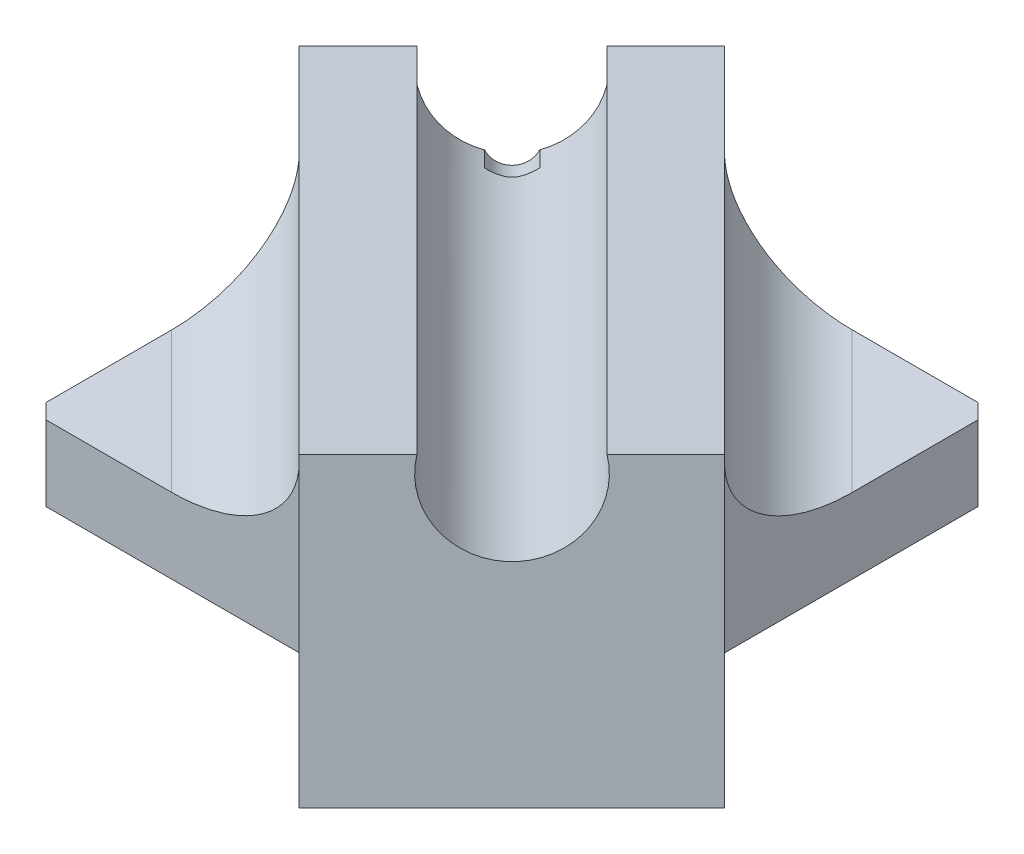
ISO-10303-21;
HEADER;
FILE_DESCRIPTION(('STEP AP214'),'2;1');
FILE_NAME('part.step','',(''),(''),'','','');
FILE_SCHEMA(('AUTOMOTIVE_DESIGN { 1 0 10303 214 1 1 1 1 }'));
ENDSEC;
DATA;
#1=APPLICATION_CONTEXT('core data for automotive mechanical design processes');
#2=APPLICATION_PROTOCOL_DEFINITION('international standard','automotive_design',2000,#1);
#3=PRODUCT_CONTEXT('',#1,'mechanical');
#4=PRODUCT('Part','Part','',(#3));
#5=PRODUCT_RELATED_PRODUCT_CATEGORY('part','',(#4));
#6=PRODUCT_DEFINITION_FORMATION('','',#4);
#7=PRODUCT_DEFINITION_CONTEXT('part definition',#1,'design');
#8=PRODUCT_DEFINITION('design','',#6,#7);
#9=PRODUCT_DEFINITION_SHAPE('','',#8);
#10=(LENGTH_UNIT() NAMED_UNIT(*) SI_UNIT(.MILLI.,.METRE.));
#11=(NAMED_UNIT(*) PLANE_ANGLE_UNIT() SI_UNIT($,.RADIAN.));
#12=(NAMED_UNIT(*) SI_UNIT($,.STERADIAN.) SOLID_ANGLE_UNIT());
#13=UNCERTAINTY_MEASURE_WITH_UNIT(LENGTH_MEASURE(1.E-05),#10,'distance_accuracy_value','');
#14=(GEOMETRIC_REPRESENTATION_CONTEXT(3) GLOBAL_UNCERTAINTY_ASSIGNED_CONTEXT((#13)) GLOBAL_UNIT_ASSIGNED_CONTEXT((#10,
#11,#12)) REPRESENTATION_CONTEXT('',''));
#15=CARTESIAN_POINT('',(0.,0.,0.));
#16=DIRECTION('',(0.,0.,1.));
#17=DIRECTION('',(1.,0.,0.));
#18=AXIS2_PLACEMENT_3D('',#15,#16,#17);
#19=CARTESIAN_POINT('',(0.,5.,0.));
#20=DIRECTION('',(0.,1.,0.));
#21=DIRECTION('',(0.,0.,1.));
#22=AXIS2_PLACEMENT_3D('',#19,#20,#21);
#23=PLANE('',#22);
#24=CARTESIAN_POINT('',(-17.6037161868033,5.,-17.6114393949631));
#25=DIRECTION('',(0.,1.,0.));
#26=DIRECTION('',(-0.707106781186548,0.,-0.707106781186547));
#27=AXIS2_PLACEMENT_3D('',#24,#25,#26);
#28=ELLIPSE('',#27,8.34339519950923,1.44881537194977);
#29=CARTESIAN_POINT('',(-16.,5.,-14.156631808591));
#30=VERTEX_POINT('',#29);
#31=CARTESIAN_POINT('',(-15.9097976733528,5.,-14.0804206747715));
#32=VERTEX_POINT('',#31);
#33=EDGE_CURVE('E265',#30,#32,#28,.T.);
#34=ORIENTED_EDGE('',*,*,#33,.F.);
#35=DIRECTION('',(0.,0.,1.));
#36=VECTOR('',#35,1.);
#37=CARTESIAN_POINT('',(-16.,5.,16.));
#38=LINE('',#37,#36);
#39=CARTESIAN_POINT('',(-16.,5.,-14.1045146425066));
#40=VERTEX_POINT('',#39);
#41=EDGE_CURVE('E331',#30,#40,#38,.T.);
#42=ORIENTED_EDGE('',*,*,#41,.T.);
#43=CARTESIAN_POINT('',(-32.8858444157036,5.,-32.8858444157036));
#44=DIRECTION('',(0.,1.,0.));
#45=DIRECTION('',(0.707106781186548,0.,0.707106781186548));
#46=AXIS2_PLACEMENT_3D('',#43,#44,#45);
#47=ELLIPSE('',#46,26.3751688127983,4.58);
#48=EDGE_CURVE('E350',#32,#40,#47,.F.);
#49=ORIENTED_EDGE('',*,*,#48,.F.);
#50=EDGE_LOOP('',(#34,#42,#49));
#51=FACE_BOUND('',#50,.T.);
#52=ADVANCED_FACE('F35',(#51),#23,.T.);
#53=DIRECTION('',(-0.701968169373424,0.,-0.71220831867265));
#54=VECTOR('',#53,1.);
#55=CARTESIAN_POINT('',(0.820894913174256,5.,-0.809092065258149));
#56=LINE('',#55,#54);
#57=CARTESIAN_POINT('',(-14.0867905583232,5.,-15.934247404471));
#58=VERTEX_POINT('',#57);
#59=CARTESIAN_POINT('',(-14.1515977613633,5.,-16.));
#60=VERTEX_POINT('',#59);
#61=EDGE_CURVE('E260',#58,#60,#56,.T.);
#62=ORIENTED_EDGE('',*,*,#61,.F.);
#63=CARTESIAN_POINT('',(-14.1045146425066,5.,-16.));
#64=VERTEX_POINT('',#63);
#65=EDGE_CURVE('E351',#64,#58,#47,.F.);
#66=ORIENTED_EDGE('',*,*,#65,.F.);
#67=DIRECTION('',(-1.,0.,0.));
#68=VECTOR('',#67,1.);
#69=CARTESIAN_POINT('',(16.,5.,-16.));
#70=LINE('',#69,#68);
#71=EDGE_CURVE('E340',#64,#60,#70,.T.);
#72=ORIENTED_EDGE('',*,*,#71,.T.);
#73=EDGE_LOOP('',(#62,#66,#72));
#74=FACE_BOUND('',#73,.T.);
#75=ADVANCED_FACE('F396',(#74),#23,.T.);
#76=CARTESIAN_POINT('',(16.,5.,-16.));
#77=DIRECTION('',(0.,0.,1.));
#78=DIRECTION('',(1.,0.,0.));
#79=AXIS2_PLACEMENT_3D('',#76,#77,#78);
#80=PLANE('',#79);
#81=CARTESIAN_POINT('',(-16.,9.21072183403139,-16.));
#82=DIRECTION('',(0.,0.,1.));
#83=DIRECTION('',(0.970287525247815,0.241954785752361,0.));
#84=AXIS2_PLACEMENT_3D('',#81,#82,#83);
#85=ELLIPSE('',#84,6.57701779444509,4.58);
#86=CARTESIAN_POINT('',(-14.1525431538522,4.98360366927338,-16.));
#87=VERTEX_POINT('',#86);
#88=EDGE_CURVE('E324',#64,#87,#85,.F.);
#89=ORIENTED_EDGE('',*,*,#88,.T.);
#90=DIRECTION('',(0.0575631778132726,0.998341865575133,0.));
#91=VECTOR('',#90,1.);
#92=CARTESIAN_POINT('',(-14.0516898560351,6.7327438890642,-16.));
#93=LINE('',#92,#91);
#94=EDGE_CURVE('E257',#87,#60,#93,.T.);
#95=ORIENTED_EDGE('',*,*,#94,.T.);
#96=ORIENTED_EDGE('',*,*,#71,.F.);
#97=EDGE_LOOP('',(#89,#95,#96));
#98=FACE_BOUND('',#97,.T.);
#99=ADVANCED_FACE('F392',(#98),#80,.F.);
#100=CARTESIAN_POINT('',(-16.,5.,16.));
#101=DIRECTION('',(1.,0.,0.));
#102=DIRECTION('',(0.,0.,-1.));
#103=AXIS2_PLACEMENT_3D('',#100,#101,#102);
#104=PLANE('',#103);
#105=DIRECTION('',(0.,0.970287525247815,-0.241954785752361));
#106=VECTOR('',#105,1.);
#107=CARTESIAN_POINT('',(-16.,-2.07974308648351,-12.3911987002612));
#108=LINE('',#107,#106);
#109=CARTESIAN_POINT('',(-16.,4.98360366927338,-14.1525431538522));
#110=VERTEX_POINT('',#109);
#111=EDGE_CURVE('E354',#110,#30,#108,.T.);
#112=ORIENTED_EDGE('',*,*,#111,.F.);
#113=CARTESIAN_POINT('',(-16.,9.21072183403139,-16.));
#114=DIRECTION('',(1.,0.,0.));
#115=DIRECTION('',(0.,0.241954785752361,0.970287525247815));
#116=AXIS2_PLACEMENT_3D('',#113,#114,#115);
#117=ELLIPSE('',#116,6.57701779444509,4.58);
#118=EDGE_CURVE('E327',#110,#40,#117,.F.);
#119=ORIENTED_EDGE('',*,*,#118,.T.);
#120=ORIENTED_EDGE('',*,*,#41,.F.);
#121=EDGE_LOOP('',(#112,#119,#120));
#122=FACE_BOUND('',#121,.T.);
#123=ADVANCED_FACE('F395',(#122),#104,.F.);
#124=DIRECTION('',(0.,0.,1.));
#125=VECTOR('',#124,1.);
#126=CARTESIAN_POINT('',(-16.,0.,16.));
#127=LINE('',#126,#125);
#128=CARTESIAN_POINT('',(-16.,0.,-6.25204097902476));
#129=VERTEX_POINT('',#128);
#130=CARTESIAN_POINT('',(-16.,0.,15.));
#131=VERTEX_POINT('',#130);
#132=EDGE_CURVE('E330',#129,#131,#127,.T.);
#133=ORIENTED_EDGE('',*,*,#132,.T.);
#134=DIRECTION('',(0.,1.,0.));
#135=VECTOR('',#134,1.);
#136=CARTESIAN_POINT('',(-16.,5.,15.));
#137=LINE('',#136,#135);
#138=CARTESIAN_POINT('',(-16.,5.,15.));
#139=VERTEX_POINT('',#138);
#140=EDGE_CURVE('E44',#131,#139,#137,.T.);
#141=ORIENTED_EDGE('',*,*,#140,.T.);
#142=CARTESIAN_POINT('',(-16.,5.,6.63887279737288));
#143=VERTEX_POINT('',#142);
#144=EDGE_CURVE('E335',#143,#139,#38,.T.);
#145=ORIENTED_EDGE('',*,*,#144,.F.);
#146=CARTESIAN_POINT('',(-16.,11.,6.63887279737288));
#147=DIRECTION('',(1.,0.,0.));
#148=DIRECTION('',(0.,0.,-1.));
#149=AXIS2_PLACEMENT_3D('',#146,#147,#148);
#150=ELLIPSE('',#149,8.48528137423857,6.);
#151=CARTESIAN_POINT('',(-16.,11.,-1.84640857686569));
#152=VERTEX_POINT('',#151);
#153=EDGE_CURVE('E504',#143,#152,#150,.T.);
#154=ORIENTED_EDGE('',*,*,#153,.T.);
#155=DIRECTION('',(0.,-1.,0.));
#156=VECTOR('',#155,1.);
#157=CARTESIAN_POINT('',(-16.,4.99999999999999,-1.84640857686569));
#158=LINE('',#157,#156);
#159=CARTESIAN_POINT('',(-16.,0.549748037251333,-1.84640857686569));
#160=VERTEX_POINT('',#159);
#161=EDGE_CURVE('E319',#152,#160,#158,.T.);
#162=ORIENTED_EDGE('',*,*,#161,.T.);
#163=DIRECTION('',(0.,-0.12382271652573,-0.992304355967557));
#164=VECTOR('',#163,1.);
#165=CARTESIAN_POINT('',(-16.,2.81076461708729,16.273179363364));
#166=LINE('',#165,#164);
#167=EDGE_CURVE('E316',#160,#129,#166,.T.);
#168=ORIENTED_EDGE('',*,*,#167,.T.);
#169=EDGE_LOOP('',(#133,#141,#145,#154,#162,#168));
#170=FACE_BOUND('',#169,.T.);
#171=ADVANCED_FACE('F403',(#170),#104,.F.);
#172=CARTESIAN_POINT('',(15.,5.,-16.));
#173=VERTEX_POINT('',#172);
#174=CARTESIAN_POINT('',(6.61596119856617,5.,-16.));
#175=VERTEX_POINT('',#174);
#176=EDGE_CURVE('E243',#173,#175,#70,.T.);
#177=ORIENTED_EDGE('',*,*,#176,.F.);
#178=DIRECTION('',(0.,-1.,0.));
#179=VECTOR('',#178,1.);
#180=CARTESIAN_POINT('',(15.,5.,-16.));
#181=LINE('',#180,#179);
#182=CARTESIAN_POINT('',(15.,0.,-16.));
#183=VERTEX_POINT('',#182);
#184=EDGE_CURVE('E490',#173,#183,#181,.T.);
#185=ORIENTED_EDGE('',*,*,#184,.T.);
#186=DIRECTION('',(-1.,0.,0.));
#187=VECTOR('',#186,1.);
#188=CARTESIAN_POINT('',(16.,0.,-16.));
#189=LINE('',#188,#187);
#190=CARTESIAN_POINT('',(-6.23623555925377,0.,-16.));
#191=VERTEX_POINT('',#190);
#192=EDGE_CURVE('E346',#183,#191,#189,.T.);
#193=ORIENTED_EDGE('',*,*,#192,.T.);
#194=DIRECTION('',(0.992328965241095,0.123625340216061,0.));
#195=VECTOR('',#194,1.);
#196=CARTESIAN_POINT('',(16.2735436441686,2.80429092537412,-16.));
#197=LINE('',#196,#195);
#198=CARTESIAN_POINT('',(-1.86932017567241,0.544034709153964,-16.));
#199=VERTEX_POINT('',#198);
#200=EDGE_CURVE('E300',#191,#199,#197,.T.);
#201=ORIENTED_EDGE('',*,*,#200,.T.);
#202=DIRECTION('',(0.,1.,0.));
#203=VECTOR('',#202,1.);
#204=CARTESIAN_POINT('',(-1.86932017567241,5.,-16.));
#205=LINE('',#204,#203);
#206=CARTESIAN_POINT('',(-1.86932017567241,11.,-16.));
#207=VERTEX_POINT('',#206);
#208=EDGE_CURVE('E322',#199,#207,#205,.T.);
#209=ORIENTED_EDGE('',*,*,#208,.T.);
#210=CARTESIAN_POINT('',(6.61596119856616,11.,-16.));
#211=DIRECTION('',(0.,0.,1.));
#212=DIRECTION('',(1.,0.,0.));
#213=AXIS2_PLACEMENT_3D('',#210,#211,#212);
#214=ELLIPSE('',#213,8.48528137423857,6.);
#215=EDGE_CURVE('E526',#207,#175,#214,.T.);
#216=ORIENTED_EDGE('',*,*,#215,.T.);
#217=EDGE_LOOP('',(#177,#185,#193,#201,#209,#216));
#218=FACE_BOUND('',#217,.T.);
#219=ADVANCED_FACE('F398',(#218),#80,.F.);
#220=DIRECTION('',(0.,0.,-1.));
#221=VECTOR('',#220,1.);
#222=CARTESIAN_POINT('',(16.,5.,16.));
#223=LINE('',#222,#221);
#224=CARTESIAN_POINT('',(16.,5.,-6.61596119856616));
#225=VERTEX_POINT('',#224);
#226=CARTESIAN_POINT('',(16.,5.,-15.));
#227=VERTEX_POINT('',#226);
#228=EDGE_CURVE('E337',#225,#227,#223,.T.);
#229=ORIENTED_EDGE('',*,*,#228,.T.);
#230=DIRECTION('',(0.707106781186545,0.,0.70710678118655));
#231=VECTOR('',#230,1.);
#232=CARTESIAN_POINT('',(15.5000000000001,5.,-15.4999999999999));
#233=LINE('',#232,#231);
#234=EDGE_CURVE('E487',#227,#173,#233,.F.);
#235=ORIENTED_EDGE('',*,*,#234,.T.);
#236=ORIENTED_EDGE('',*,*,#176,.T.);
#237=DIRECTION('',(-0.707106781186548,0.,-0.707106781186548));
#238=VECTOR('',#237,1.);
#239=CARTESIAN_POINT('',(20.2426406871193,5.,-2.37332051144687));
#240=LINE('',#239,#238);
#241=EDGE_CURVE('E527',#175,#225,#240,.F.);
#242=ORIENTED_EDGE('',*,*,#241,.T.);
#243=EDGE_LOOP('',(#229,#235,#236,#242));
#244=FACE_BOUND('',#243,.T.);
#245=ADVANCED_FACE('F388',(#244),#23,.T.);
#246=CARTESIAN_POINT('',(16.,5.,16.));
#247=DIRECTION('',(0.,0.,-1.));
#248=DIRECTION('',(-1.,0.,0.));
#249=AXIS2_PLACEMENT_3D('',#246,#247,#248);
#250=PLANE('',#249);
#251=DIRECTION('',(1.,0.,0.));
#252=VECTOR('',#251,1.);
#253=CARTESIAN_POINT('',(16.,5.,16.));
#254=LINE('',#253,#252);
#255=CARTESIAN_POINT('',(-15.,5.,16.));
#256=VERTEX_POINT('',#255);
#257=CARTESIAN_POINT('',(-6.63887279737288,5.,16.));
#258=VERTEX_POINT('',#257);
#259=EDGE_CURVE('E334',#256,#258,#254,.T.);
#260=ORIENTED_EDGE('',*,*,#259,.F.);
#261=DIRECTION('',(0.,-1.,0.));
#262=VECTOR('',#261,1.);
#263=CARTESIAN_POINT('',(-15.,5.,16.));
#264=LINE('',#263,#262);
#265=CARTESIAN_POINT('',(-15.,0.,16.));
#266=VERTEX_POINT('',#265);
#267=EDGE_CURVE('E493',#256,#266,#264,.T.);
#268=ORIENTED_EDGE('',*,*,#267,.T.);
#269=DIRECTION('',(1.,0.,0.));
#270=VECTOR('',#269,1.);
#271=CARTESIAN_POINT('',(16.,0.,16.));
#272=LINE('',#271,#270);
#273=CARTESIAN_POINT('',(16.,0.,16.));
#274=VERTEX_POINT('',#273);
#275=EDGE_CURVE('E238',#266,#274,#272,.T.);
#276=ORIENTED_EDGE('',*,*,#275,.T.);
#277=DIRECTION('',(0.,-1.,0.));
#278=VECTOR('',#277,1.);
#279=CARTESIAN_POINT('',(16.,5.,16.));
#280=LINE('',#279,#278);
#281=CARTESIAN_POINT('',(16.,6.76326865006806,16.));
#282=VERTEX_POINT('',#281);
#283=EDGE_CURVE('E234',#282,#274,#280,.T.);
#284=ORIENTED_EDGE('',*,*,#283,.F.);
#285=DIRECTION('',(-0.992328965241095,-0.123625340216062,0.));
#286=VECTOR('',#285,1.);
#287=CARTESIAN_POINT('',(4.31887442463834,5.3080222812293,15.9999999999999));
#288=LINE('',#287,#286);
#289=CARTESIAN_POINT('',(1.84640857686555,5.,16.0000000000001));
#290=VERTEX_POINT('',#289);
#291=EDGE_CURVE('E223',#282,#290,#288,.T.);
#292=ORIENTED_EDGE('',*,*,#291,.T.);
#293=DIRECTION('',(0.,-1.,0.));
#294=VECTOR('',#293,1.);
#295=CARTESIAN_POINT('',(1.84640857686569,10.2914652592007,16.));
#296=LINE('',#295,#294);
#297=CARTESIAN_POINT('',(1.84640857686569,11.,16.));
#298=VERTEX_POINT('',#297);
#299=EDGE_CURVE('E531',#298,#290,#296,.T.);
#300=ORIENTED_EDGE('',*,*,#299,.F.);
#301=CARTESIAN_POINT('',(-6.63887279737288,11.,16.));
#302=DIRECTION('',(0.,0.,-1.));
#303=DIRECTION('',(-1.,0.,0.));
#304=AXIS2_PLACEMENT_3D('',#301,#302,#303);
#305=ELLIPSE('',#304,8.48528137423857,6.);
#306=EDGE_CURVE('E506',#298,#258,#305,.T.);
#307=ORIENTED_EDGE('',*,*,#306,.T.);
#308=EDGE_LOOP('',(#260,#268,#276,#284,#292,#300,#307));
#309=FACE_BOUND('',#308,.T.);
#310=ADVANCED_FACE('F235',(#309),#250,.F.);
#311=CARTESIAN_POINT('',(16.,5.,16.));
#312=DIRECTION('',(-1.,0.,0.));
#313=DIRECTION('',(0.,0.,1.));
#314=AXIS2_PLACEMENT_3D('',#311,#312,#313);
#315=PLANE('',#314);
#316=DIRECTION('',(0.,0.,-1.));
#317=VECTOR('',#316,1.);
#318=CARTESIAN_POINT('',(16.,0.,16.));
#319=LINE('',#318,#317);
#320=CARTESIAN_POINT('',(16.,0.,-15.));
#321=VERTEX_POINT('',#320);
#322=EDGE_CURVE('E344',#274,#321,#319,.T.);
#323=ORIENTED_EDGE('',*,*,#322,.T.);
#324=DIRECTION('',(0.,1.,0.));
#325=VECTOR('',#324,1.);
#326=CARTESIAN_POINT('',(16.,5.,-15.));
#327=LINE('',#326,#325);
#328=EDGE_CURVE('E488',#321,#227,#327,.T.);
#329=ORIENTED_EDGE('',*,*,#328,.T.);
#330=ORIENTED_EDGE('',*,*,#228,.F.);
#331=CARTESIAN_POINT('',(16.,11.,-6.61596119856616));
#332=DIRECTION('',(-1.,0.,0.));
#333=DIRECTION('',(0.,0.,1.));
#334=AXIS2_PLACEMENT_3D('',#331,#332,#333);
#335=ELLIPSE('',#334,8.48528137423857,6.);
#336=CARTESIAN_POINT('',(16.,10.9009604785299,1.86816411559598));
#337=VERTEX_POINT('',#336);
#338=EDGE_CURVE('E467',#225,#337,#335,.T.);
#339=ORIENTED_EDGE('',*,*,#338,.T.);
#340=DIRECTION('',(0.,0.99999998080954,-0.000195910489226005));
#341=VECTOR('',#340,1.);
#342=CARTESIAN_POINT('',(16.,4.99723165165565,1.8693207180209));
#343=LINE('',#342,#341);
#344=CARTESIAN_POINT('',(16.,5.,1.86932017567241));
#345=VERTEX_POINT('',#344);
#346=EDGE_CURVE('E247',#345,#337,#343,.T.);
#347=ORIENTED_EDGE('',*,*,#346,.F.);
#348=DIRECTION('',(0.,0.12382271652573,0.992304355967557));
#349=VECTOR('',#348,1.);
#350=CARTESIAN_POINT('',(16.,7.04524072394658,18.2596993913692));
#351=LINE('',#350,#349);
#352=EDGE_CURVE('E214',#345,#282,#351,.T.);
#353=ORIENTED_EDGE('',*,*,#352,.T.);
#354=ORIENTED_EDGE('',*,*,#283,.T.);
#355=EDGE_LOOP('',(#323,#329,#330,#339,#347,#353,#354));
#356=FACE_BOUND('',#355,.T.);
#357=ADVANCED_FACE('F245',(#356),#315,.F.);
#358=ORIENTED_EDGE('',*,*,#144,.T.);
#359=DIRECTION('',(-0.707106781186545,0.,-0.70710678118655));
#360=VECTOR('',#359,1.);
#361=CARTESIAN_POINT('',(-15.5000000000001,5.,15.4999999999999));
#362=LINE('',#361,#360);
#363=EDGE_CURVE('E11',#139,#256,#362,.F.);
#364=ORIENTED_EDGE('',*,*,#363,.T.);
#365=ORIENTED_EDGE('',*,*,#259,.T.);
#366=DIRECTION('',(0.707106781186548,0.,0.707106781186548));
#367=VECTOR('',#366,1.);
#368=CARTESIAN_POINT('',(-20.2426406871193,5.,2.39623211025359));
#369=LINE('',#368,#367);
#370=EDGE_CURVE('E535',#258,#143,#369,.F.);
#371=ORIENTED_EDGE('',*,*,#370,.T.);
#372=EDGE_LOOP('',(#358,#364,#365,#371));
#373=FACE_BOUND('',#372,.T.);
#374=ADVANCED_FACE('F385',(#373),#23,.T.);
#375=CARTESIAN_POINT('',(0.,0.,0.));
#376=DIRECTION('',(0.,1.,0.));
#377=DIRECTION('',(0.,0.,1.));
#378=AXIS2_PLACEMENT_3D('',#375,#376,#377);
#379=PLANE('',#378);
#380=ORIENTED_EDGE('',*,*,#192,.F.);
#381=DIRECTION('',(-0.707106781186545,0.,-0.70710678118655));
#382=VECTOR('',#381,1.);
#383=CARTESIAN_POINT('',(15.,0.,-16.));
#384=LINE('',#383,#382);
#385=EDGE_CURVE('E496',#183,#321,#384,.F.);
#386=ORIENTED_EDGE('',*,*,#385,.T.);
#387=ORIENTED_EDGE('',*,*,#322,.F.);
#388=ORIENTED_EDGE('',*,*,#275,.F.);
#389=DIRECTION('',(0.707106781186545,0.,0.70710678118655));
#390=VECTOR('',#389,1.);
#391=CARTESIAN_POINT('',(-15.,0.,16.));
#392=LINE('',#391,#390);
#393=EDGE_CURVE('E500',#266,#131,#392,.F.);
#394=ORIENTED_EDGE('',*,*,#393,.T.);
#395=ORIENTED_EDGE('',*,*,#132,.F.);
#396=DIRECTION('',(0.707679338975407,0.,-0.706533759410922));
#397=VECTOR('',#396,1.);
#398=CARTESIAN_POINT('',(-11.1130556380688,0.,-11.1310744365598));
#399=LINE('',#398,#397);
#400=EDGE_CURVE('E242',#129,#191,#399,.T.);
#401=ORIENTED_EDGE('',*,*,#400,.T.);
#402=EDGE_LOOP('',(#380,#386,#387,#388,#394,#395,#401));
#403=FACE_BOUND('',#402,.T.);
#404=ADVANCED_FACE('F381',(#403),#379,.F.);
#405=CARTESIAN_POINT('',(-15.6152785916971,9.30665750618846,-15.6152785916971));
#406=DIRECTION('',(0.696364240320019,0.173648177666927,0.696364240320019));
#407=DIRECTION('',(0.707106781186548,0.,-0.707106781186548));
#408=AXIS2_PLACEMENT_3D('',#405,#406,#407);
#409=CYLINDRICAL_SURFACE('',#408,4.58);
#410=DIRECTION('',(-0.696364240320019,-0.173648177666927,-0.696364240320019));
#411=VECTOR('',#410,1.);
#412=CARTESIAN_POINT('',(-14.9459490531895,5.2403491545764,-13.1165720546081));
#413=LINE('',#412,#411);
#414=CARTESIAN_POINT('',(-14.5977669330295,5.32717324340986,-12.7683899344481));
#415=VERTEX_POINT('',#414);
#416=EDGE_CURVE('E262',#32,#415,#413,.F.);
#417=ORIENTED_EDGE('',*,*,#416,.F.);
#418=ORIENTED_EDGE('',*,*,#48,.T.);
#419=ORIENTED_EDGE('',*,*,#118,.F.);
#420=CARTESIAN_POINT('',(-15.6152785916971,9.30665750618846,-15.6152785916971));
#421=DIRECTION('',(-0.696364240320019,-0.173648177666927,-0.696364240320019));
#422=DIRECTION('',(0.707106781186548,0.,-0.707106781186548));
#423=AXIS2_PLACEMENT_3D('',#420,#421,#422);
#424=CIRCLE('',#423,4.58);
#425=CARTESIAN_POINT('',(-18.8984777612956,10.2914652592007,-12.5776550300366));
#426=VERTEX_POINT('',#425);
#427=EDGE_CURVE('E281',#110,#426,#424,.T.);
#428=ORIENTED_EDGE('',*,*,#427,.T.);
#429=DIRECTION('',(0.696364240320019,0.173648177666927,0.696364240320019));
#430=VECTOR('',#429,1.);
#431=CARTESIAN_POINT('',(-18.8984777612956,10.2914652592007,-12.5776550300366));
#432=LINE('',#431,#430);
#433=CARTESIAN_POINT('',(12.4379130531053,18.1056332542124,18.7587357843643));
#434=VERTEX_POINT('',#433);
#435=EDGE_CURVE('E297',#426,#434,#432,.T.);
#436=ORIENTED_EDGE('',*,*,#435,.T.);
#437=CARTESIAN_POINT('',(15.7211122227038,17.1208255012002,15.7211122227038));
#438=DIRECTION('',(-0.696364240320019,-0.173648177666927,-0.696364240320019));
#439=DIRECTION('',(0.707106781186548,0.,-0.707106781186548));
#440=AXIS2_PLACEMENT_3D('',#437,#438,#439);
#441=CIRCLE('',#440,4.58);
#442=CARTESIAN_POINT('',(18.7587357843643,18.1056332542124,12.4379130531053));
#443=VERTEX_POINT('',#442);
#444=EDGE_CURVE('E267',#443,#434,#441,.T.);
#445=ORIENTED_EDGE('',*,*,#444,.F.);
#446=DIRECTION('',(0.696364240320019,0.173648177666927,0.696364240320019));
#447=VECTOR('',#446,1.);
#448=CARTESIAN_POINT('',(-12.5776550300366,10.2914652592007,-18.8984777612956));
#449=LINE('',#448,#447);
#450=CARTESIAN_POINT('',(-12.5776550300366,10.2914652592007,-18.8984777612956));
#451=VERTEX_POINT('',#450);
#452=EDGE_CURVE('E298',#451,#443,#449,.T.);
#453=ORIENTED_EDGE('',*,*,#452,.F.);
#454=EDGE_CURVE('E282',#451,#87,#424,.T.);
#455=ORIENTED_EDGE('',*,*,#454,.T.);
#456=ORIENTED_EDGE('',*,*,#88,.F.);
#457=ORIENTED_EDGE('',*,*,#65,.T.);
#458=DIRECTION('',(-0.696364240320019,-0.173648177666927,-0.696364240320019));
#459=VECTOR('',#458,1.);
#460=CARTESIAN_POINT('',(-12.0634504328922,5.50454820227416,-13.9109072790399));
#461=LINE('',#460,#459);
#462=CARTESIAN_POINT('',(-12.7598146732122,5.33090002460723,-14.60727151936));
#463=VERTEX_POINT('',#462);
#464=EDGE_CURVE('E255',#463,#58,#461,.T.);
#465=ORIENTED_EDGE('',*,*,#464,.F.);
#466=CARTESIAN_POINT('',(-12.7598146732122,5.33090002460723,-14.60727151936));
#467=CARTESIAN_POINT('',(-12.763682133456,5.32637235621939,-14.5710942577702));
#468=CARTESIAN_POINT('',(-12.7678051269917,5.32206022412393,-14.5349181659168));
#469=CARTESIAN_POINT('',(-12.7766336127534,5.31386089338401,-14.4625838343661));
#470=CARTESIAN_POINT('',(-12.7813391872698,5.30997375491683,-14.4264255979168));
#471=CARTESIAN_POINT('',(-12.7964766862895,5.29891215061462,-14.3177185648517));
#472=CARTESIAN_POINT('',(-12.8078987069297,5.2923747287532,-14.245235900869));
#473=CARTESIAN_POINT('',(-12.8346320124548,5.28075673725322,-14.0986273072941));
#474=CARTESIAN_POINT('',(-12.8500486567127,5.27572515875044,-14.0245164455431));
#475=CARTESIAN_POINT('',(-12.8861006234222,5.26727031059369,-13.8775504745293));
#476=CARTESIAN_POINT('',(-12.906725925257,5.26384398841917,-13.8046932377513));
#477=CARTESIAN_POINT('',(-12.9407586850837,5.26004744560987,-13.7051265000082));
#478=CARTESIAN_POINT('',(-12.9509140657561,5.25908670536377,-13.6773301385892));
#479=CARTESIAN_POINT('',(-12.9725985861352,5.25736082797769,-13.6222721303662));
#480=CARTESIAN_POINT('',(-12.9841278298811,5.2565957056652,-13.5950105242402));
#481=CARTESIAN_POINT('',(-13.0209637479107,5.25457393960808,-13.5145385126261));
#482=CARTESIAN_POINT('',(-13.0486150099751,5.25358004950212,-13.4623432035439));
#483=CARTESIAN_POINT('',(-13.1113011506907,5.25215031230718,-13.3632841942797));
#484=CARTESIAN_POINT('',(-13.1462495969954,5.25170832192039,-13.3163671885242));
#485=CARTESIAN_POINT('',(-13.2238481739381,5.25126033304268,-13.2295277854238));
#486=CARTESIAN_POINT('',(-13.2664825971006,5.25125345523809,-13.1895914439289));
#487=CARTESIAN_POINT('',(-13.3675410679459,5.25174960700457,-13.1100262196565));
#488=CARTESIAN_POINT('',(-13.4273994560363,5.25236033219114,-13.0722334948062));
#489=CARTESIAN_POINT('',(-13.5212872118564,5.25396924526452,-13.0228855727787));
#490=CARTESIAN_POINT('',(-13.5534899403052,5.25462762546872,-13.0075846889358));
#491=CARTESIAN_POINT('',(-13.6188373372622,5.25621379719433,-12.9791570720977));
#492=CARTESIAN_POINT('',(-13.6519818989492,5.25714155827214,-12.9660300936857));
#493=CARTESIAN_POINT('',(-13.7605000935425,5.26063841028758,-12.926423154238));
#494=CARTESIAN_POINT('',(-13.8371820449963,5.26381469397558,-12.9036140330717));
#495=CARTESIAN_POINT('',(-13.9920817984787,5.27194284375681,-12.8640410900495));
#496=CARTESIAN_POINT('',(-14.0703027721873,5.27689884383467,-12.847291526907));
#497=CARTESIAN_POINT('',(-14.2235148986858,5.28844523993399,-12.8187297864851));
#498=CARTESIAN_POINT('',(-14.2984759451368,5.29494338453672,-12.8067154788288));
#499=CARTESIAN_POINT('',(-14.4108775068725,5.30603368961957,-12.7908481144877));
#500=CARTESIAN_POINT('',(-14.4482425952401,5.30994261854336,-12.7859278578137));
#501=CARTESIAN_POINT('',(-14.52299349523,5.31821526509133,-12.7767111089326));
#502=CARTESIAN_POINT('',(-14.560379302648,5.3225789107987,-12.7724145183444));
#503=CARTESIAN_POINT('',(-14.5977669330295,5.32717324340986,-12.7683899344481));
#504=B_SPLINE_CURVE_WITH_KNOTS('',3,(#466,#467,#468,#469,#470,#471,#472,#473,#474,#475,#476,
#477,#478,#479,#480,#481,#482,#483,#484,#485,#486,#487,#488,#489,#490,#491,#492,#493,#494,#495,
#496,#497,#498,#499,#500,#501,#502,#503),.UNSPECIFIED.,.F.,.F.,(4,2,2,2,2,2,2,2,2,2,2,2,2,2,2,2,
2,2,4),(0.,0.109988359115161,0.219992271999328,0.44090644498686,0.668376504185694,
0.895412237807379,0.984205890127505,1.07300627085002,1.24967245717774,1.42435408299818,
1.5986826855658,1.80972627724676,1.91665023880556,2.02356212124555,2.26329209190642,
2.50358255604623,2.73206857291374,2.84573214295887,2.9593777634834),.UNSPECIFIED.);
#505=EDGE_CURVE('E360',#463,#415,#504,.T.);
#506=ORIENTED_EDGE('',*,*,#505,.T.);
#507=EDGE_LOOP('',(#417,#418,#419,#428,#436,#445,#453,#455,#456,#457,#465,#506));
#508=FACE_BOUND('',#507,.T.);
#509=ADVANCED_FACE('F375',(#508),#409,.F.);
#510=CARTESIAN_POINT('',(-8.67272648350228,10.2914652592007,-22.8034063078299));
#511=DIRECTION('',(0.707106781186548,0.,-0.707106781186548));
#512=DIRECTION('',(-0.707106781186548,0.,-0.707106781186548));
#513=AXIS2_PLACEMENT_3D('',#510,#511,#512);
#514=PLANE('',#513);
#515=DIRECTION('',(-0.122787803968971,0.984807753012209,-0.122787803968971));
#516=VECTOR('',#515,1.);
#517=CARTESIAN_POINT('',(22.6636643308986,18.1056332542124,8.53298450657101));
#518=LINE('',#517,#516);
#519=CARTESIAN_POINT('',(23.5496089230538,11.,9.41892909872616));
#520=VERTEX_POINT('',#519);
#521=CARTESIAN_POINT('',(22.6636643308986,18.1056332542124,8.53298450657101));
#522=VERTEX_POINT('',#521);
#523=EDGE_CURVE('E276',#520,#522,#518,.T.);
#524=ORIENTED_EDGE('',*,*,#523,.F.);
#525=DIRECTION('',(-0.707106781186548,0.,-0.707106781186548));
#526=VECTOR('',#525,1.);
#527=CARTESIAN_POINT('',(-1.86932017567241,11.,-16.));
#528=LINE('',#527,#526);
#529=EDGE_CURVE('E368',#520,#207,#528,.T.);
#530=ORIENTED_EDGE('',*,*,#529,.T.);
#531=ORIENTED_EDGE('',*,*,#208,.F.);
#532=DIRECTION('',(0.696364240320019,0.173648177666927,0.696364240320019));
#533=VECTOR('',#532,1.);
#534=CARTESIAN_POINT('',(-7.28889616752355,-0.807412479288526,-21.4195759918511));
#535=LINE('',#534,#533);
#536=CARTESIAN_POINT('',(-7.28889616752355,-0.807412479288526,-21.4195759918511));
#537=VERTEX_POINT('',#536);
#538=EDGE_CURVE('E304',#537,#199,#535,.T.);
#539=ORIENTED_EDGE('',*,*,#538,.F.);
#540=DIRECTION('',(-0.122787803968971,0.984807753012209,-0.122787803968971));
#541=VECTOR('',#540,1.);
#542=CARTESIAN_POINT('',(-8.67272648350228,10.2914652592007,-22.8034063078299));
#543=LINE('',#542,#541);
#544=CARTESIAN_POINT('',(-8.67272648350228,10.2914652592007,-22.8034063078299));
#545=VERTEX_POINT('',#544);
#546=EDGE_CURVE('E292',#537,#545,#543,.T.);
#547=ORIENTED_EDGE('',*,*,#546,.T.);
#548=DIRECTION('',(0.696364240320019,0.173648177666927,0.696364240320019));
#549=VECTOR('',#548,1.);
#550=CARTESIAN_POINT('',(-8.67272648350228,10.2914652592007,-22.8034063078299));
#551=LINE('',#550,#549);
#552=EDGE_CURVE('E301',#545,#522,#551,.T.);
#553=ORIENTED_EDGE('',*,*,#552,.T.);
#554=EDGE_LOOP('',(#524,#530,#531,#539,#547,#553));
#555=FACE_BOUND('',#554,.T.);
#556=ADVANCED_FACE('F380',(#555),#514,.T.);
#557=CARTESIAN_POINT('',(-22.8148621072332,10.2914652592007,-8.66127068409892));
#558=DIRECTION('',(-0.707106781186547,0.,0.707106781186547));
#559=DIRECTION('',(0.707106781186548,0.,0.707106781186548));
#560=AXIS2_PLACEMENT_3D('',#557,#558,#559);
#561=PLANE('',#560);
#562=DIRECTION('',(0.707106781186548,0.,0.707106781186548));
#563=VECTOR('',#562,1.);
#564=CARTESIAN_POINT('',(1.8464085768657,11.,16.));
#565=LINE('',#564,#563);
#566=EDGE_CURVE('E528',#152,#298,#565,.T.);
#567=ORIENTED_EDGE('',*,*,#566,.T.);
#568=ORIENTED_EDGE('',*,*,#299,.T.);
#569=DIRECTION('',(0.696364240320019,0.173648177666927,0.696364240320019));
#570=VECTOR('',#569,1.);
#571=CARTESIAN_POINT('',(-21.4313772258739,-0.804641954200878,-7.2777858027396));
#572=LINE('',#571,#570);
#573=CARTESIAN_POINT('',(9.90501358852696,7.00952604081086,24.0586050116613));
#574=VERTEX_POINT('',#573);
#575=EDGE_CURVE('E310',#290,#574,#572,.T.);
#576=ORIENTED_EDGE('',*,*,#575,.T.);
#577=DIRECTION('',(0.122787803968971,-0.984807753012209,0.122787803968971));
#578=VECTOR('',#577,1.);
#579=CARTESIAN_POINT('',(8.52152870716765,18.1056332542124,22.675120130302));
#580=LINE('',#579,#578);
#581=CARTESIAN_POINT('',(8.52152870716765,18.1056332542124,22.675120130302));
#582=VERTEX_POINT('',#581);
#583=EDGE_CURVE('E273',#582,#574,#580,.T.);
#584=ORIENTED_EDGE('',*,*,#583,.F.);
#585=DIRECTION('',(0.696364240320019,0.173648177666927,0.696364240320019));
#586=VECTOR('',#585,1.);
#587=CARTESIAN_POINT('',(-22.8148621072332,10.2914652592007,-8.66127068409892));
#588=LINE('',#587,#586);
#589=CARTESIAN_POINT('',(-22.8148621072332,10.2914652592007,-8.66127068409892));
#590=VERTEX_POINT('',#589);
#591=EDGE_CURVE('E311',#590,#582,#588,.T.);
#592=ORIENTED_EDGE('',*,*,#591,.F.);
#593=DIRECTION('',(0.122787803968971,-0.984807753012209,0.122787803968971));
#594=VECTOR('',#593,1.);
#595=CARTESIAN_POINT('',(-22.8148621072332,10.2914652592007,-8.66127068409892));
#596=LINE('',#595,#594);
#597=CARTESIAN_POINT('',(-21.4313772258739,-0.804641954200878,-7.2777858027396));
#598=VERTEX_POINT('',#597);
#599=EDGE_CURVE('E288',#590,#598,#596,.T.);
#600=ORIENTED_EDGE('',*,*,#599,.T.);
#601=EDGE_CURVE('E307',#598,#160,#572,.T.);
#602=ORIENTED_EDGE('',*,*,#601,.T.);
#603=ORIENTED_EDGE('',*,*,#161,.F.);
#604=EDGE_LOOP('',(#567,#568,#576,#584,#592,#600,#602,#603));
#605=FACE_BOUND('',#604,.T.);
#606=ADVANCED_FACE('F554',(#605),#561,.T.);
#607=CARTESIAN_POINT('',(-7.28889616752355,-0.807412479288526,-21.4195759918511));
#608=DIRECTION('',(0.1226883388207,-0.984807743269432,0.122887266687743));
#609=DIRECTION('',(0.,-0.12382271652573,-0.992304355967557));
#610=AXIS2_PLACEMENT_3D('',#607,#608,#609);
#611=PLANE('',#610);
#612=ORIENTED_EDGE('',*,*,#167,.F.);
#613=ORIENTED_EDGE('',*,*,#601,.F.);
#614=DIRECTION('',(0.707124045921887,-0.000138526253011965,-0.707089502460288));
#615=VECTOR('',#614,1.);
#616=CARTESIAN_POINT('',(-7.28889616752355,-0.807412479288526,-21.4195759918511));
#617=LINE('',#616,#615);
#618=EDGE_CURVE('E290',#598,#537,#617,.T.);
#619=ORIENTED_EDGE('',*,*,#618,.T.);
#620=ORIENTED_EDGE('',*,*,#538,.T.);
#621=ORIENTED_EDGE('',*,*,#200,.F.);
#622=ORIENTED_EDGE('',*,*,#400,.F.);
#623=EDGE_LOOP('',(#612,#613,#619,#620,#621,#622));
#624=FACE_BOUND('',#623,.T.);
#625=ADVANCED_FACE('F565',(#624),#611,.T.);
#626=CARTESIAN_POINT('',(-15.6152785916971,9.30665750618846,-15.6152785916971));
#627=DIRECTION('',(0.696364240320019,0.173648177666927,0.696364240320019));
#628=DIRECTION('',(0.707106781186548,0.,-0.707106781186548));
#629=AXIS2_PLACEMENT_3D('',#626,#627,#628);
#630=PLANE('',#629);
#631=ORIENTED_EDGE('',*,*,#111,.T.);
#632=CARTESIAN_POINT('',(-15.1507208780787,5.61168874063636,-15.1584440862385));
#633=DIRECTION('',(-0.696364240320019,-0.173648177666927,-0.696364240320019));
#634=DIRECTION('',(-0.707106781186547,0.,0.707106781186547));
#635=AXIS2_PLACEMENT_3D('',#632,#633,#634);
#636=CIRCLE('',#635,1.44881537194977);
#637=EDGE_CURVE('E249',#87,#30,#636,.T.);
#638=ORIENTED_EDGE('',*,*,#637,.F.);
#639=ORIENTED_EDGE('',*,*,#454,.F.);
#640=DIRECTION('',(-0.707106781186547,0.,0.707106781186547));
#641=VECTOR('',#640,1.);
#642=CARTESIAN_POINT('',(-12.5776550300366,10.2914652592007,-18.8984777612956));
#643=LINE('',#642,#641);
#644=EDGE_CURVE('E294',#545,#451,#643,.T.);
#645=ORIENTED_EDGE('',*,*,#644,.F.);
#646=ORIENTED_EDGE('',*,*,#546,.F.);
#647=ORIENTED_EDGE('',*,*,#618,.F.);
#648=ORIENTED_EDGE('',*,*,#599,.F.);
#649=DIRECTION('',(-0.707106781186548,0.,0.707106781186548));
#650=VECTOR('',#649,1.);
#651=CARTESIAN_POINT('',(-18.8984777612956,10.2914652592007,-12.5776550300366));
#652=LINE('',#651,#650);
#653=EDGE_CURVE('E285',#426,#590,#652,.T.);
#654=ORIENTED_EDGE('',*,*,#653,.F.);
#655=ORIENTED_EDGE('',*,*,#427,.F.);
#656=EDGE_LOOP('',(#631,#638,#639,#645,#646,#647,#648,#654,#655));
#657=FACE_BOUND('',#656,.T.);
#658=ADVANCED_FACE('F422',(#657),#630,.F.);
#659=CARTESIAN_POINT('',(-12.5776550300366,10.2914652592007,-18.8984777612956));
#660=DIRECTION('',(-0.122787803968971,0.984807753012209,-0.122787803968971));
#661=DIRECTION('',(0.,0.123724030206482,0.992316665359131));
#662=AXIS2_PLACEMENT_3D('',#659,#660,#661);
#663=PLANE('',#662);
#664=ORIENTED_EDGE('',*,*,#452,.T.);
#665=DIRECTION('',(-0.707106781186547,0.,0.707106781186547));
#666=VECTOR('',#665,1.);
#667=CARTESIAN_POINT('',(18.7587357843643,18.1056332542124,12.4379130531053));
#668=LINE('',#667,#666);
#669=EDGE_CURVE('E278',#522,#443,#668,.T.);
#670=ORIENTED_EDGE('',*,*,#669,.F.);
#671=ORIENTED_EDGE('',*,*,#552,.F.);
#672=ORIENTED_EDGE('',*,*,#644,.T.);
#673=EDGE_LOOP('',(#664,#670,#671,#672));
#674=FACE_BOUND('',#673,.T.);
#675=ADVANCED_FACE('F687',(#674),#663,.T.);
#676=CARTESIAN_POINT('',(-18.8984777612956,10.2914652592007,-12.5776550300366));
#677=DIRECTION('',(-0.122787803968971,0.984807753012209,-0.122787803968971));
#678=DIRECTION('',(0.,0.123724030206482,0.992316665359131));
#679=AXIS2_PLACEMENT_3D('',#676,#677,#678);
#680=PLANE('',#679);
#681=ORIENTED_EDGE('',*,*,#591,.T.);
#682=DIRECTION('',(-0.707106781186548,0.,0.707106781186548));
#683=VECTOR('',#682,1.);
#684=CARTESIAN_POINT('',(12.4379130531053,18.1056332542124,18.7587357843643));
#685=LINE('',#684,#683);
#686=EDGE_CURVE('E270',#434,#582,#685,.T.);
#687=ORIENTED_EDGE('',*,*,#686,.F.);
#688=ORIENTED_EDGE('',*,*,#435,.F.);
#689=ORIENTED_EDGE('',*,*,#653,.T.);
#690=EDGE_LOOP('',(#681,#687,#688,#689));
#691=FACE_BOUND('',#690,.T.);
#692=ADVANCED_FACE('F383',(#691),#680,.T.);
#693=CARTESIAN_POINT('',(15.7211122227038,17.1208255012002,15.7211122227038));
#694=DIRECTION('',(0.696364240320019,0.173648177666927,0.696364240320019));
#695=DIRECTION('',(0.707106781186548,0.,-0.707106781186548));
#696=AXIS2_PLACEMENT_3D('',#693,#694,#695);
#697=PLANE('',#696);
#698=ORIENTED_EDGE('',*,*,#444,.T.);
#699=ORIENTED_EDGE('',*,*,#686,.T.);
#700=ORIENTED_EDGE('',*,*,#583,.T.);
#701=DIRECTION('',(-0.1226883388207,0.984807743269432,-0.122887266687743));
#702=VECTOR('',#701,1.);
#703=CARTESIAN_POINT('',(14.5417735006716,-30.2093091724903,28.7028830039118));
#704=LINE('',#703,#702);
#705=CARTESIAN_POINT('',(10.7782673903426,0.,24.9332747142696));
#706=VERTEX_POINT('',#705);
#707=EDGE_CURVE('E540',#706,#574,#704,.T.);
#708=ORIENTED_EDGE('',*,*,#707,.F.);
#709=DIRECTION('',(0.707106781186548,0.,-0.707106781186547));
#710=VECTOR('',#709,1.);
#711=CARTESIAN_POINT('',(10.775216300686,0.,24.9363258039262));
#712=LINE('',#711,#710);
#713=CARTESIAN_POINT('',(24.920403293892,0.,10.7911388107202));
#714=VERTEX_POINT('',#713);
#715=EDGE_CURVE('E544',#706,#714,#712,.T.);
#716=ORIENTED_EDGE('',*,*,#715,.T.);
#717=DIRECTION('',(-0.1226883388207,0.984807743269432,-0.122887266687743));
#718=VECTOR('',#717,1.);
#719=CARTESIAN_POINT('',(28.6842545590219,-30.2120796975779,14.5610928148003));
#720=LINE('',#719,#718);
#721=CARTESIAN_POINT('',(23.5602124946789,10.9181234684944,9.42874258711994));
#722=VERTEX_POINT('',#721);
#723=EDGE_CURVE('E515',#714,#722,#720,.T.);
#724=ORIENTED_EDGE('',*,*,#723,.T.);
#725=CARTESIAN_POINT('',(27.792249610173,11.,5.17628841160687));
#726=DIRECTION('',(0.696364240320019,0.173648177666927,0.696364240320019));
#727=DIRECTION('',(0.122787803968971,-0.984807753012209,0.122787803968971));
#728=AXIS2_PLACEMENT_3D('',#725,#726,#727);
#729=ELLIPSE('',#728,6.09255967131447,6.);
#730=EDGE_CURVE('E466',#722,#520,#729,.F.);
#731=ORIENTED_EDGE('',*,*,#730,.T.);
#732=ORIENTED_EDGE('',*,*,#523,.T.);
#733=ORIENTED_EDGE('',*,*,#669,.T.);
#734=EDGE_LOOP('',(#698,#699,#700,#708,#716,#724,#731,#732,#733));
#735=FACE_BOUND('',#734,.T.);
#736=ADVANCED_FACE('F512',(#735),#697,.T.);
#737=CARTESIAN_POINT('',(-13.0616281571186,6.13263327363714,-13.0693513652784));
#738=DIRECTION('',(-0.696364240320019,-0.173648177666927,-0.696364240320019));
#739=DIRECTION('',(-0.707106781186547,0.,0.707106781186548));
#740=AXIS2_PLACEMENT_3D('',#737,#738,#739);
#741=CYLINDRICAL_SURFACE('',#740,1.44881537194977);
#742=ORIENTED_EDGE('',*,*,#416,.T.);
#743=CARTESIAN_POINT('',(-13.7579923974387,5.95898509597022,-13.7657156055985));
#744=DIRECTION('',(-0.696364240320019,-0.173648177666927,-0.696364240320019));
#745=DIRECTION('',(-0.707106781186548,0.,0.707106781186548));
#746=AXIS2_PLACEMENT_3D('',#743,#744,#745);
#747=CIRCLE('',#746,1.44881537194977);
#748=EDGE_CURVE('E357',#415,#463,#747,.F.);
#749=ORIENTED_EDGE('',*,*,#748,.T.);
#750=ORIENTED_EDGE('',*,*,#464,.T.);
#751=EDGE_CURVE('E251',#58,#87,#461,.T.);
#752=ORIENTED_EDGE('',*,*,#751,.T.);
#753=ORIENTED_EDGE('',*,*,#637,.T.);
#754=ORIENTED_EDGE('',*,*,#33,.T.);
#755=EDGE_LOOP('',(#742,#749,#750,#752,#753,#754));
#756=FACE_BOUND('',#755,.T.);
#757=ADVANCED_FACE('F429',(#756),#741,.F.);
#758=CARTESIAN_POINT('',(-12.0634504328922,5.50454820227416,-13.9109072790399));
#759=DIRECTION('',(0.711608564561146,-0.0410304843939234,-0.701377038541771));
#760=DIRECTION('',(-0.701968169373424,0.,-0.71220831867265));
#761=AXIS2_PLACEMENT_3D('',#758,#759,#760);
#762=PLANE('',#761);
#763=ORIENTED_EDGE('',*,*,#61,.T.);
#764=ORIENTED_EDGE('',*,*,#94,.F.);
#765=ORIENTED_EDGE('',*,*,#751,.F.);
#766=EDGE_LOOP('',(#763,#764,#765));
#767=FACE_BOUND('',#766,.T.);
#768=ADVANCED_FACE('F451',(#767),#762,.F.);
#769=CARTESIAN_POINT('',(6.48316848901016,-32.2188352133011,20.6442779922507));
#770=DIRECTION('',(0.707124045921876,-0.00013852625301483,-0.7070895024603));
#771=DIRECTION('',(-0.707089509244655,0.,-0.707124052706562));
#772=AXIS2_PLACEMENT_3D('',#769,#770,#771);
#773=PLANE('',#772);
#774=DIRECTION('',(-0.1226883388207,0.984807743269432,-0.122887266687743));
#775=VECTOR('',#774,1.);
#776=CARTESIAN_POINT('',(6.48316848901016,-32.2188352133011,20.6442779922507));
#777=LINE('',#776,#775);
#778=CARTESIAN_POINT('',(2.46931360406097,0.,16.6239150104558));
#779=VERTEX_POINT('',#778);
#780=EDGE_CURVE('E227',#779,#290,#777,.T.);
#781=ORIENTED_EDGE('',*,*,#780,.F.);
#782=DIRECTION('',(0.707089509244655,0.,0.707124052706562));
#783=VECTOR('',#782,1.);
#784=CARTESIAN_POINT('',(6.48632449295149,0.,20.6411221424821));
#785=LINE('',#784,#783);
#786=EDGE_CURVE('E218',#779,#706,#785,.T.);
#787=ORIENTED_EDGE('',*,*,#786,.T.);
#788=ORIENTED_EDGE('',*,*,#707,.T.);
#789=ORIENTED_EDGE('',*,*,#575,.F.);
#790=EDGE_LOOP('',(#781,#787,#788,#789));
#791=FACE_BOUND('',#790,.T.);
#792=ADVANCED_FACE('F447',(#791),#773,.F.);
#793=CARTESIAN_POINT('',(28.6842545590219,-30.2120796975779,14.5610928148003));
#794=DIRECTION('',(-0.707124045921887,0.00013852625301195,0.707089502460288));
#795=DIRECTION('',(0.707089509244643,0.,0.707124052706574));
#796=AXIS2_PLACEMENT_3D('',#793,#794,#795);
#797=PLANE('',#796);
#798=ORIENTED_EDGE('',*,*,#723,.F.);
#799=DIRECTION('',(-0.707089509244643,0.,-0.707124052706574));
#800=VECTOR('',#799,1.);
#801=CARTESIAN_POINT('',(28.6872139907322,0.,14.5581335276601));
#802=LINE('',#801,#800);
#803=CARTESIAN_POINT('',(16.6229050271954,0.,2.49323518612803));
#804=VERTEX_POINT('',#803);
#805=EDGE_CURVE('E538',#714,#804,#802,.T.);
#806=ORIENTED_EDGE('',*,*,#805,.T.);
#807=DIRECTION('',(-0.1226883388207,0.984807743269432,-0.122887266687743));
#808=VECTOR('',#807,1.);
#809=CARTESIAN_POINT('',(20.6367599121446,-32.2188352133011,6.51359816792292));
#810=LINE('',#809,#808);
#811=EDGE_CURVE('E219',#804,#345,#810,.T.);
#812=ORIENTED_EDGE('',*,*,#811,.T.);
#813=ORIENTED_EDGE('',*,*,#346,.T.);
#814=CARTESIAN_POINT('',(16.,10.9009604785299,1.86816411559598));
#815=CARTESIAN_POINT('',(17.2600356940968,10.9035526112454,3.1282608584229));
#816=CARTESIAN_POINT('',(18.5200712490359,10.9062789267669,4.38835743579743));
#817=CARTESIAN_POINT('',(21.0401420805955,10.9119999234218,6.90855025963875));
#818=CARTESIAN_POINT('',(22.3001773572161,10.9149946045552,8.16864650610554));
#819=CARTESIAN_POINT('',(23.5602124946789,10.9181234684946,9.42874258711994));
#820=B_SPLINE_CURVE_WITH_KNOTS('',3,(#814,#815,#816,#817,#818,#819),.UNSPECIFIED.,.F.,.F.,(4,2,
4),(0.,5.34601381885245,10.6920276376924),.UNSPECIFIED.);
#821=EDGE_CURVE('E458',#337,#722,#820,.T.);
#822=ORIENTED_EDGE('',*,*,#821,.T.);
#823=EDGE_LOOP('',(#798,#806,#812,#813,#822));
#824=FACE_BOUND('',#823,.T.);
#825=ADVANCED_FACE('F450',(#824),#797,.F.);
#826=CARTESIAN_POINT('',(20.6367599121446,-32.2188352133011,6.51359816792292));
#827=DIRECTION('',(0.992445248624536,0.121744173038205,-0.015191603398808));
#828=DIRECTION('',(-0.121758223823437,0.992559789096537,0.));
#829=AXIS2_PLACEMENT_3D('',#826,#827,#828);
#830=PLANE('',#829);
#831=ORIENTED_EDGE('',*,*,#811,.F.);
#832=DIRECTION('',(0.0153054528164535,0.,0.999882864696702));
#833=VECTOR('',#832,1.);
#834=CARTESIAN_POINT('',(16.6853715685218,0.,6.57408304068964));
#835=LINE('',#834,#833);
#836=CARTESIAN_POINT('',(16.8425748084801,0.,16.8439409661043));
#837=VERTEX_POINT('',#836);
#838=EDGE_CURVE('E215',#804,#837,#835,.T.);
#839=ORIENTED_EDGE('',*,*,#838,.T.);
#840=DIRECTION('',(-0.1226883388207,0.984807743269432,-0.122887266687743));
#841=VECTOR('',#840,1.);
#842=CARTESIAN_POINT('',(20.6367599121446,-30.4555665632331,20.6442779922505));
#843=LINE('',#842,#841);
#844=EDGE_CURVE('E209',#837,#282,#843,.T.);
#845=ORIENTED_EDGE('',*,*,#844,.T.);
#846=ORIENTED_EDGE('',*,*,#352,.F.);
#847=EDGE_LOOP('',(#831,#839,#845,#846));
#848=FACE_BOUND('',#847,.T.);
#849=ADVANCED_FACE('F212',(#848),#830,.F.);
#850=CARTESIAN_POINT('',(20.6367599121446,-30.4555665632331,20.6442779922505));
#851=DIRECTION('',(-0.0151919801524839,0.121944594193556,0.992420636467227));
#852=DIRECTION('',(0.,-0.992535179780829,0.121958668808071));
#853=AXIS2_PLACEMENT_3D('',#850,#851,#852);
#854=PLANE('',#853);
#855=ORIENTED_EDGE('',*,*,#844,.F.);
#856=DIRECTION('',(-0.99988285307843,0.,-0.015306211802336));
#857=VECTOR('',#856,1.);
#858=CARTESIAN_POINT('',(20.6940329591551,0.,16.9028991070711));
#859=LINE('',#858,#857);
#860=EDGE_CURVE('E231',#837,#779,#859,.T.);
#861=ORIENTED_EDGE('',*,*,#860,.T.);
#862=ORIENTED_EDGE('',*,*,#780,.T.);
#863=ORIENTED_EDGE('',*,*,#291,.F.);
#864=EDGE_LOOP('',(#855,#861,#862,#863));
#865=FACE_BOUND('',#864,.T.);
#866=ADVANCED_FACE('F225',(#865),#854,.F.);
#867=CARTESIAN_POINT('',(0.,0.,0.));
#868=DIRECTION('',(0.,1.,0.));
#869=DIRECTION('',(0.,0.,1.));
#870=AXIS2_PLACEMENT_3D('',#867,#868,#869);
#871=PLANE('',#870);
#872=ORIENTED_EDGE('',*,*,#838,.F.);
#873=ORIENTED_EDGE('',*,*,#805,.F.);
#874=ORIENTED_EDGE('',*,*,#715,.F.);
#875=ORIENTED_EDGE('',*,*,#786,.F.);
#876=ORIENTED_EDGE('',*,*,#860,.F.);
#877=EDGE_LOOP('',(#872,#873,#874,#875,#876));
#878=FACE_BOUND('',#877,.T.);
#879=ADVANCED_FACE('F433',(#878),#871,.F.);
#880=CARTESIAN_POINT('',(-13.0616281571186,6.13263327363714,-13.0693513652784));
#881=DIRECTION('',(-0.696364240320019,-0.173648177666927,-0.696364240320019));
#882=DIRECTION('',(-0.707106781186548,0.,0.707106781186548));
#883=AXIS2_PLACEMENT_3D('',#880,#881,#882);
#884=CONICAL_SURFACE('',#883,0.44881537194975,0.785398163397454);
#885=ORIENTED_EDGE('',*,*,#505,.F.);
#886=ORIENTED_EDGE('',*,*,#748,.F.);
#887=EDGE_LOOP('',(#885,#886));
#888=FACE_BOUND('',#887,.T.);
#889=ADVANCED_FACE('F371',(#888),#884,.F.);
#890=CARTESIAN_POINT('',(-4.43008579638299,11.,-27.0460469949492));
#891=DIRECTION('',(0.707106781186548,0.,0.707106781186548));
#892=DIRECTION('',(0.707106781186548,0.,-0.707106781186548));
#893=AXIS2_PLACEMENT_3D('',#890,#891,#892);
#894=CYLINDRICAL_SURFACE('',#893,6.);
#895=ORIENTED_EDGE('',*,*,#338,.F.);
#896=ORIENTED_EDGE('',*,*,#241,.F.);
#897=ORIENTED_EDGE('',*,*,#215,.F.);
#898=ORIENTED_EDGE('',*,*,#529,.F.);
#899=ORIENTED_EDGE('',*,*,#730,.F.);
#900=ORIENTED_EDGE('',*,*,#821,.F.);
#901=EDGE_LOOP('',(#895,#896,#897,#898,#899,#900));
#902=FACE_BOUND('',#901,.T.);
#903=ADVANCED_FACE('F432',(#902),#894,.F.);
#904=CARTESIAN_POINT('',(-27.0575027943525,11.,-4.41862999697963));
#905=DIRECTION('',(-0.707106781186548,0.,-0.707106781186548));
#906=DIRECTION('',(-0.707106781186548,0.,0.707106781186548));
#907=AXIS2_PLACEMENT_3D('',#904,#905,#906);
#908=CYLINDRICAL_SURFACE('',#907,6.);
#909=ORIENTED_EDGE('',*,*,#153,.F.);
#910=ORIENTED_EDGE('',*,*,#370,.F.);
#911=ORIENTED_EDGE('',*,*,#306,.F.);
#912=ORIENTED_EDGE('',*,*,#566,.F.);
#913=EDGE_LOOP('',(#909,#910,#911,#912));
#914=FACE_BOUND('',#913,.T.);
#915=ADVANCED_FACE('F438',(#914),#908,.F.);
#916=CARTESIAN_POINT('',(15.,5.,-16.));
#917=DIRECTION('',(-0.70710678118655,0.,0.707106781186545));
#918=DIRECTION('',(0.,-1.,0.));
#919=AXIS2_PLACEMENT_3D('',#916,#917,#918);
#920=PLANE('',#919);
#921=ORIENTED_EDGE('',*,*,#234,.F.);
#922=ORIENTED_EDGE('',*,*,#328,.F.);
#923=ORIENTED_EDGE('',*,*,#385,.F.);
#924=ORIENTED_EDGE('',*,*,#184,.F.);
#925=EDGE_LOOP('',(#921,#922,#923,#924));
#926=FACE_BOUND('',#925,.T.);
#927=ADVANCED_FACE('F473',(#926),#920,.F.);
#928=CARTESIAN_POINT('',(-15.,5.,16.));
#929=DIRECTION('',(0.70710678118655,0.,-0.707106781186545));
#930=DIRECTION('',(0.,-1.,0.));
#931=AXIS2_PLACEMENT_3D('',#928,#929,#930);
#932=PLANE('',#931);
#933=ORIENTED_EDGE('',*,*,#363,.F.);
#934=ORIENTED_EDGE('',*,*,#140,.F.);
#935=ORIENTED_EDGE('',*,*,#393,.F.);
#936=ORIENTED_EDGE('',*,*,#267,.F.);
#937=EDGE_LOOP('',(#933,#934,#935,#936));
#938=FACE_BOUND('',#937,.T.);
#939=ADVANCED_FACE('F38',(#938),#932,.F.);
#940=CLOSED_SHELL('',(#52,#75,#99,#123,#171,#219,#245,#310,#357,#374,#404,#509,#556,#606,#625,
#658,#675,#692,#736,#757,#768,#792,#825,#849,#866,#879,#889,#903,#915,#927,#939));
#941=MANIFOLD_SOLID_BREP('B2',#940);
#942=ADVANCED_BREP_SHAPE_REPRESENTATION('',(#18,#941),#14);
#943=SHAPE_DEFINITION_REPRESENTATION(#9,#942);
ENDSEC;
END-ISO-10303-21;
